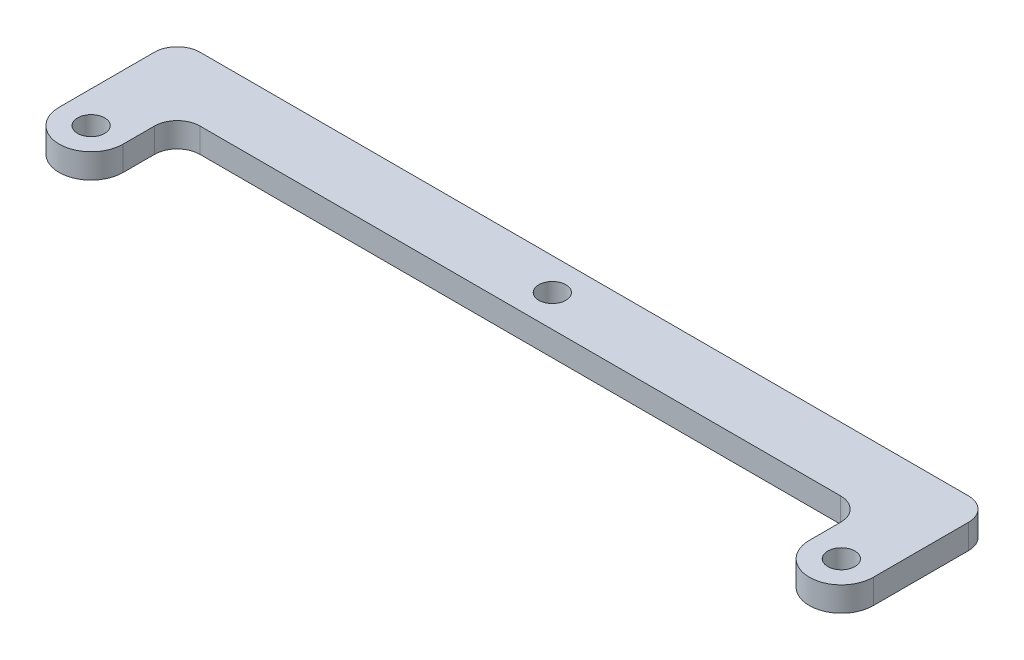
ISO-10303-21;
HEADER;
FILE_DESCRIPTION(('STEP AP214'),'2;1');
FILE_NAME('part.step','',(''),(''),'','','');
FILE_SCHEMA(('AUTOMOTIVE_DESIGN { 1 0 10303 214 1 1 1 1 }'));
ENDSEC;
DATA;
#1=APPLICATION_CONTEXT('core data for automotive mechanical design processes');
#2=APPLICATION_PROTOCOL_DEFINITION('international standard','automotive_design',2000,#1);
#3=PRODUCT_CONTEXT('',#1,'mechanical');
#4=PRODUCT('Part','Part','',(#3));
#5=PRODUCT_RELATED_PRODUCT_CATEGORY('part','',(#4));
#6=PRODUCT_DEFINITION_FORMATION('','',#4);
#7=PRODUCT_DEFINITION_CONTEXT('part definition',#1,'design');
#8=PRODUCT_DEFINITION('design','',#6,#7);
#9=PRODUCT_DEFINITION_SHAPE('','',#8);
#10=(LENGTH_UNIT() NAMED_UNIT(*) SI_UNIT(.MILLI.,.METRE.));
#11=(NAMED_UNIT(*) PLANE_ANGLE_UNIT() SI_UNIT($,.RADIAN.));
#12=(NAMED_UNIT(*) SI_UNIT($,.STERADIAN.) SOLID_ANGLE_UNIT());
#13=UNCERTAINTY_MEASURE_WITH_UNIT(LENGTH_MEASURE(1.E-05),#10,'distance_accuracy_value','');
#14=(GEOMETRIC_REPRESENTATION_CONTEXT(3) GLOBAL_UNCERTAINTY_ASSIGNED_CONTEXT((#13)) GLOBAL_UNIT_ASSIGNED_CONTEXT((#10,
#11,#12)) REPRESENTATION_CONTEXT('',''));
#15=CARTESIAN_POINT('',(0.,0.,0.));
#16=DIRECTION('',(0.,0.,1.));
#17=DIRECTION('',(1.,0.,0.));
#18=AXIS2_PLACEMENT_3D('',#15,#16,#17);
#19=CARTESIAN_POINT('',(-31.25,2.,-0.749999999999998));
#20=DIRECTION('',(0.,-1.,0.));
#21=DIRECTION('',(0.,0.,-1.));
#22=AXIS2_PLACEMENT_3D('',#19,#20,#21);
#23=CYLINDRICAL_SURFACE('',#22,1.85);
#24=CARTESIAN_POINT('',(-31.25,0.,-0.749999999999998));
#25=DIRECTION('',(0.,1.,0.));
#26=DIRECTION('',(0.,0.,1.));
#27=AXIS2_PLACEMENT_3D('',#24,#25,#26);
#28=CIRCLE('',#27,1.85);
#29=CARTESIAN_POINT('',(-33.1,0.,-0.749999999999985));
#30=VERTEX_POINT('',#29);
#31=CARTESIAN_POINT('',(-31.25,0.,-2.6));
#32=VERTEX_POINT('',#31);
#33=EDGE_CURVE('E168',#30,#32,#28,.F.);
#34=ORIENTED_EDGE('',*,*,#33,.F.);
#35=DIRECTION('',(0.,-1.,0.));
#36=VECTOR('',#35,1.);
#37=CARTESIAN_POINT('',(-33.1,2.,-0.749999999999985));
#38=LINE('',#37,#36);
#39=CARTESIAN_POINT('',(-33.1,2.,-0.749999999999985));
#40=VERTEX_POINT('',#39);
#41=EDGE_CURVE('E11',#40,#30,#38,.T.);
#42=ORIENTED_EDGE('',*,*,#41,.F.);
#43=CARTESIAN_POINT('',(-31.25,2.,-0.749999999999998));
#44=DIRECTION('',(0.,1.,0.));
#45=DIRECTION('',(0.,0.,1.));
#46=AXIS2_PLACEMENT_3D('',#43,#44,#45);
#47=CIRCLE('',#46,1.85);
#48=CARTESIAN_POINT('',(-31.25,2.,-2.6));
#49=VERTEX_POINT('',#48);
#50=EDGE_CURVE('E206',#40,#49,#47,.F.);
#51=ORIENTED_EDGE('',*,*,#50,.T.);
#52=DIRECTION('',(0.,-1.,0.));
#53=VECTOR('',#52,1.);
#54=CARTESIAN_POINT('',(-31.25,2.,-2.6));
#55=LINE('',#54,#53);
#56=EDGE_CURVE('E57',#49,#32,#55,.T.);
#57=ORIENTED_EDGE('',*,*,#56,.T.);
#58=EDGE_LOOP('',(#34,#42,#51,#57));
#59=FACE_BOUND('',#58,.T.);
#60=ADVANCED_FACE('F41',(#59),#23,.T.);
#61=CARTESIAN_POINT('',(-33.1,2.,0.));
#62=DIRECTION('',(-1.,0.,0.));
#63=DIRECTION('',(0.,0.,1.));
#64=AXIS2_PLACEMENT_3D('',#61,#62,#63);
#65=PLANE('',#64);
#66=DIRECTION('',(0.,0.,-1.));
#67=VECTOR('',#66,1.);
#68=CARTESIAN_POINT('',(-33.1,0.,0.));
#69=LINE('',#68,#67);
#70=CARTESIAN_POINT('',(-33.1,0.,7.));
#71=VERTEX_POINT('',#70);
#72=EDGE_CURVE('E170',#71,#30,#69,.T.);
#73=ORIENTED_EDGE('',*,*,#72,.F.);
#74=DIRECTION('',(0.,-1.,0.));
#75=VECTOR('',#74,1.);
#76=CARTESIAN_POINT('',(-33.1,2.,7.));
#77=LINE('',#76,#75);
#78=CARTESIAN_POINT('',(-33.1,2.,7.));
#79=VERTEX_POINT('',#78);
#80=EDGE_CURVE('E49',#79,#71,#77,.T.);
#81=ORIENTED_EDGE('',*,*,#80,.F.);
#82=DIRECTION('',(0.,0.,-1.));
#83=VECTOR('',#82,1.);
#84=CARTESIAN_POINT('',(-33.1,2.,0.));
#85=LINE('',#84,#83);
#86=EDGE_CURVE('E240',#79,#40,#85,.T.);
#87=ORIENTED_EDGE('',*,*,#86,.T.);
#88=ORIENTED_EDGE('',*,*,#41,.T.);
#89=EDGE_LOOP('',(#73,#81,#87,#88));
#90=FACE_BOUND('',#89,.T.);
#91=ADVANCED_FACE('F239',(#90),#65,.T.);
#92=CARTESIAN_POINT('',(-30.5,2.,7.));
#93=DIRECTION('',(0.,-1.,0.));
#94=DIRECTION('',(0.,0.,-1.));
#95=AXIS2_PLACEMENT_3D('',#92,#93,#94);
#96=CYLINDRICAL_SURFACE('',#95,2.6);
#97=CARTESIAN_POINT('',(-30.5,0.,7.));
#98=DIRECTION('',(0.,1.,0.));
#99=DIRECTION('',(0.,0.,1.));
#100=AXIS2_PLACEMENT_3D('',#97,#98,#99);
#101=CIRCLE('',#100,2.6);
#102=CARTESIAN_POINT('',(-27.9,0.,7.));
#103=VERTEX_POINT('',#102);
#104=EDGE_CURVE('E173',#71,#103,#101,.T.);
#105=ORIENTED_EDGE('',*,*,#104,.T.);
#106=DIRECTION('',(0.,-1.,0.));
#107=VECTOR('',#106,1.);
#108=CARTESIAN_POINT('',(-27.9,2.,7.));
#109=LINE('',#108,#107);
#110=CARTESIAN_POINT('',(-27.9,2.,7.));
#111=VERTEX_POINT('',#110);
#112=EDGE_CURVE('E222',#111,#103,#109,.T.);
#113=ORIENTED_EDGE('',*,*,#112,.F.);
#114=CARTESIAN_POINT('',(-30.5,2.,7.));
#115=DIRECTION('',(0.,1.,0.));
#116=DIRECTION('',(0.,0.,1.));
#117=AXIS2_PLACEMENT_3D('',#114,#115,#116);
#118=CIRCLE('',#117,2.6);
#119=EDGE_CURVE('E229',#79,#111,#118,.T.);
#120=ORIENTED_EDGE('',*,*,#119,.F.);
#121=ORIENTED_EDGE('',*,*,#80,.T.);
#122=EDGE_LOOP('',(#105,#113,#120,#121));
#123=FACE_BOUND('',#122,.T.);
#124=ADVANCED_FACE('F227',(#123),#96,.T.);
#125=CARTESIAN_POINT('',(-27.9,2.,0.));
#126=DIRECTION('',(-1.,0.,0.));
#127=DIRECTION('',(0.,0.,1.));
#128=AXIS2_PLACEMENT_3D('',#125,#126,#127);
#129=PLANE('',#128);
#130=DIRECTION('',(0.,0.,-1.));
#131=VECTOR('',#130,1.);
#132=CARTESIAN_POINT('',(-27.9,0.,0.));
#133=LINE('',#132,#131);
#134=CARTESIAN_POINT('',(-27.9,0.,4.45000000000001));
#135=VERTEX_POINT('',#134);
#136=EDGE_CURVE('E175',#103,#135,#133,.T.);
#137=ORIENTED_EDGE('',*,*,#136,.T.);
#138=DIRECTION('',(0.,-1.,0.));
#139=VECTOR('',#138,1.);
#140=CARTESIAN_POINT('',(-27.9,2.,4.45000000000001));
#141=LINE('',#140,#139);
#142=CARTESIAN_POINT('',(-27.9,2.,4.45000000000001));
#143=VERTEX_POINT('',#142);
#144=EDGE_CURVE('E219',#143,#135,#141,.T.);
#145=ORIENTED_EDGE('',*,*,#144,.F.);
#146=DIRECTION('',(0.,0.,-1.));
#147=VECTOR('',#146,1.);
#148=CARTESIAN_POINT('',(-27.9,2.,0.));
#149=LINE('',#148,#147);
#150=EDGE_CURVE('E444',#111,#143,#149,.T.);
#151=ORIENTED_EDGE('',*,*,#150,.F.);
#152=ORIENTED_EDGE('',*,*,#112,.T.);
#153=EDGE_LOOP('',(#137,#145,#151,#152));
#154=FACE_BOUND('',#153,.T.);
#155=ADVANCED_FACE('F263',(#154),#129,.F.);
#156=CARTESIAN_POINT('',(-26.05,2.,4.45));
#157=DIRECTION('',(0.,-1.,0.));
#158=DIRECTION('',(0.,0.,-1.));
#159=AXIS2_PLACEMENT_3D('',#156,#157,#158);
#160=CYLINDRICAL_SURFACE('',#159,1.85);
#161=CARTESIAN_POINT('',(-26.05,0.,4.45));
#162=DIRECTION('',(0.,1.,0.));
#163=DIRECTION('',(0.,0.,1.));
#164=AXIS2_PLACEMENT_3D('',#161,#162,#163);
#165=CIRCLE('',#164,1.85);
#166=CARTESIAN_POINT('',(-26.05,0.,2.6));
#167=VERTEX_POINT('',#166);
#168=EDGE_CURVE('E177',#135,#167,#165,.F.);
#169=ORIENTED_EDGE('',*,*,#168,.T.);
#170=DIRECTION('',(0.,-1.,0.));
#171=VECTOR('',#170,1.);
#172=CARTESIAN_POINT('',(-26.05,2.,2.6));
#173=LINE('',#172,#171);
#174=CARTESIAN_POINT('',(-26.05,2.,2.6));
#175=VERTEX_POINT('',#174);
#176=EDGE_CURVE('E216',#175,#167,#173,.T.);
#177=ORIENTED_EDGE('',*,*,#176,.F.);
#178=CARTESIAN_POINT('',(-26.05,2.,4.45));
#179=DIRECTION('',(0.,1.,0.));
#180=DIRECTION('',(0.,0.,1.));
#181=AXIS2_PLACEMENT_3D('',#178,#179,#180);
#182=CIRCLE('',#181,1.85);
#183=EDGE_CURVE('E442',#143,#175,#182,.F.);
#184=ORIENTED_EDGE('',*,*,#183,.F.);
#185=ORIENTED_EDGE('',*,*,#144,.T.);
#186=EDGE_LOOP('',(#169,#177,#184,#185));
#187=FACE_BOUND('',#186,.T.);
#188=ADVANCED_FACE('F268',(#187),#160,.F.);
#189=CARTESIAN_POINT('',(0.,2.,2.6));
#190=DIRECTION('',(0.,0.,-1.));
#191=DIRECTION('',(-1.,0.,0.));
#192=AXIS2_PLACEMENT_3D('',#189,#190,#191);
#193=PLANE('',#192);
#194=DIRECTION('',(1.,0.,0.));
#195=VECTOR('',#194,1.);
#196=CARTESIAN_POINT('',(0.,0.,2.6));
#197=LINE('',#196,#195);
#198=CARTESIAN_POINT('',(26.05,0.,2.6));
#199=VERTEX_POINT('',#198);
#200=EDGE_CURVE('E179',#167,#199,#197,.T.);
#201=ORIENTED_EDGE('',*,*,#200,.T.);
#202=DIRECTION('',(0.,-1.,0.));
#203=VECTOR('',#202,1.);
#204=CARTESIAN_POINT('',(26.05,2.,2.6));
#205=LINE('',#204,#203);
#206=CARTESIAN_POINT('',(26.05,2.,2.6));
#207=VERTEX_POINT('',#206);
#208=EDGE_CURVE('E214',#207,#199,#205,.T.);
#209=ORIENTED_EDGE('',*,*,#208,.F.);
#210=DIRECTION('',(1.,0.,0.));
#211=VECTOR('',#210,1.);
#212=CARTESIAN_POINT('',(0.,2.,2.6));
#213=LINE('',#212,#211);
#214=EDGE_CURVE('E446',#175,#207,#213,.T.);
#215=ORIENTED_EDGE('',*,*,#214,.F.);
#216=ORIENTED_EDGE('',*,*,#176,.T.);
#217=EDGE_LOOP('',(#201,#209,#215,#216));
#218=FACE_BOUND('',#217,.T.);
#219=ADVANCED_FACE('F272',(#218),#193,.F.);
#220=CARTESIAN_POINT('',(26.05,2.,4.45));
#221=DIRECTION('',(0.,-1.,0.));
#222=DIRECTION('',(0.,0.,-1.));
#223=AXIS2_PLACEMENT_3D('',#220,#221,#222);
#224=CYLINDRICAL_SURFACE('',#223,1.85);
#225=CARTESIAN_POINT('',(26.05,0.,4.45));
#226=DIRECTION('',(0.,1.,0.));
#227=DIRECTION('',(0.,0.,1.));
#228=AXIS2_PLACEMENT_3D('',#225,#226,#227);
#229=CIRCLE('',#228,1.85);
#230=CARTESIAN_POINT('',(27.9,0.,4.45000000000001));
#231=VERTEX_POINT('',#230);
#232=EDGE_CURVE('E182',#231,#199,#229,.T.);
#233=ORIENTED_EDGE('',*,*,#232,.F.);
#234=DIRECTION('',(0.,-1.,0.));
#235=VECTOR('',#234,1.);
#236=CARTESIAN_POINT('',(27.9,2.,4.45000000000001));
#237=LINE('',#236,#235);
#238=CARTESIAN_POINT('',(27.9,2.,4.45000000000001));
#239=VERTEX_POINT('',#238);
#240=EDGE_CURVE('E212',#239,#231,#237,.T.);
#241=ORIENTED_EDGE('',*,*,#240,.F.);
#242=CARTESIAN_POINT('',(26.05,2.,4.45));
#243=DIRECTION('',(0.,1.,0.));
#244=DIRECTION('',(0.,0.,1.));
#245=AXIS2_PLACEMENT_3D('',#242,#243,#244);
#246=CIRCLE('',#245,1.85);
#247=EDGE_CURVE('E437',#239,#207,#246,.T.);
#248=ORIENTED_EDGE('',*,*,#247,.T.);
#249=ORIENTED_EDGE('',*,*,#208,.T.);
#250=EDGE_LOOP('',(#233,#241,#248,#249));
#251=FACE_BOUND('',#250,.T.);
#252=ADVANCED_FACE('F276',(#251),#224,.F.);
#253=CARTESIAN_POINT('',(27.9,2.,0.));
#254=DIRECTION('',(-1.,0.,0.));
#255=DIRECTION('',(0.,0.,1.));
#256=AXIS2_PLACEMENT_3D('',#253,#254,#255);
#257=PLANE('',#256);
#258=DIRECTION('',(0.,0.,-1.));
#259=VECTOR('',#258,1.);
#260=CARTESIAN_POINT('',(27.9,0.,0.));
#261=LINE('',#260,#259);
#262=CARTESIAN_POINT('',(27.9,0.,7.));
#263=VERTEX_POINT('',#262);
#264=EDGE_CURVE('E185',#263,#231,#261,.T.);
#265=ORIENTED_EDGE('',*,*,#264,.F.);
#266=DIRECTION('',(0.,-1.,0.));
#267=VECTOR('',#266,1.);
#268=CARTESIAN_POINT('',(27.9,2.,7.));
#269=LINE('',#268,#267);
#270=CARTESIAN_POINT('',(27.9,2.,7.));
#271=VERTEX_POINT('',#270);
#272=EDGE_CURVE('E210',#271,#263,#269,.T.);
#273=ORIENTED_EDGE('',*,*,#272,.F.);
#274=DIRECTION('',(0.,0.,-1.));
#275=VECTOR('',#274,1.);
#276=CARTESIAN_POINT('',(27.9,2.,0.));
#277=LINE('',#276,#275);
#278=EDGE_CURVE('E433',#271,#239,#277,.T.);
#279=ORIENTED_EDGE('',*,*,#278,.T.);
#280=ORIENTED_EDGE('',*,*,#240,.T.);
#281=EDGE_LOOP('',(#265,#273,#279,#280));
#282=FACE_BOUND('',#281,.T.);
#283=ADVANCED_FACE('F280',(#282),#257,.T.);
#284=CARTESIAN_POINT('',(30.5,2.,7.));
#285=DIRECTION('',(0.,-1.,0.));
#286=DIRECTION('',(0.,0.,-1.));
#287=AXIS2_PLACEMENT_3D('',#284,#285,#286);
#288=CYLINDRICAL_SURFACE('',#287,2.6);
#289=CARTESIAN_POINT('',(30.5,0.,7.));
#290=DIRECTION('',(0.,1.,0.));
#291=DIRECTION('',(0.,0.,1.));
#292=AXIS2_PLACEMENT_3D('',#289,#290,#291);
#293=CIRCLE('',#292,2.6);
#294=CARTESIAN_POINT('',(33.1,0.,7.));
#295=VERTEX_POINT('',#294);
#296=EDGE_CURVE('E188',#295,#263,#293,.F.);
#297=ORIENTED_EDGE('',*,*,#296,.F.);
#298=DIRECTION('',(0.,-1.,0.));
#299=VECTOR('',#298,1.);
#300=CARTESIAN_POINT('',(33.1,2.,7.));
#301=LINE('',#300,#299);
#302=CARTESIAN_POINT('',(33.1,2.,7.));
#303=VERTEX_POINT('',#302);
#304=EDGE_CURVE('E151',#303,#295,#301,.T.);
#305=ORIENTED_EDGE('',*,*,#304,.F.);
#306=CARTESIAN_POINT('',(30.5,2.,7.));
#307=DIRECTION('',(0.,1.,0.));
#308=DIRECTION('',(0.,0.,1.));
#309=AXIS2_PLACEMENT_3D('',#306,#307,#308);
#310=CIRCLE('',#309,2.6);
#311=EDGE_CURVE('E141',#303,#271,#310,.F.);
#312=ORIENTED_EDGE('',*,*,#311,.T.);
#313=ORIENTED_EDGE('',*,*,#272,.T.);
#314=EDGE_LOOP('',(#297,#305,#312,#313));
#315=FACE_BOUND('',#314,.T.);
#316=ADVANCED_FACE('F284',(#315),#288,.T.);
#317=CARTESIAN_POINT('',(33.1,2.,0.));
#318=DIRECTION('',(-1.,0.,0.));
#319=DIRECTION('',(0.,0.,1.));
#320=AXIS2_PLACEMENT_3D('',#317,#318,#319);
#321=PLANE('',#320);
#322=DIRECTION('',(0.,0.,-1.));
#323=VECTOR('',#322,1.);
#324=CARTESIAN_POINT('',(33.1,0.,0.));
#325=LINE('',#324,#323);
#326=CARTESIAN_POINT('',(33.1,0.,-0.749999999999985));
#327=VERTEX_POINT('',#326);
#328=EDGE_CURVE('E148',#295,#327,#325,.T.);
#329=ORIENTED_EDGE('',*,*,#328,.T.);
#330=DIRECTION('',(0.,-1.,0.));
#331=VECTOR('',#330,1.);
#332=CARTESIAN_POINT('',(33.1,2.,-0.749999999999985));
#333=LINE('',#332,#331);
#334=CARTESIAN_POINT('',(33.1,2.,-0.749999999999985));
#335=VERTEX_POINT('',#334);
#336=EDGE_CURVE('E145',#335,#327,#333,.T.);
#337=ORIENTED_EDGE('',*,*,#336,.F.);
#338=DIRECTION('',(0.,0.,-1.));
#339=VECTOR('',#338,1.);
#340=CARTESIAN_POINT('',(33.1,2.,0.));
#341=LINE('',#340,#339);
#342=EDGE_CURVE('E132',#303,#335,#341,.T.);
#343=ORIENTED_EDGE('',*,*,#342,.F.);
#344=ORIENTED_EDGE('',*,*,#304,.T.);
#345=EDGE_LOOP('',(#329,#337,#343,#344));
#346=FACE_BOUND('',#345,.T.);
#347=ADVANCED_FACE('F146',(#346),#321,.F.);
#348=CARTESIAN_POINT('',(31.25,2.,-0.749999999999998));
#349=DIRECTION('',(0.,-1.,0.));
#350=DIRECTION('',(0.,0.,-1.));
#351=AXIS2_PLACEMENT_3D('',#348,#349,#350);
#352=CYLINDRICAL_SURFACE('',#351,1.85);
#353=CARTESIAN_POINT('',(31.25,0.,-0.749999999999998));
#354=DIRECTION('',(0.,1.,0.));
#355=DIRECTION('',(0.,0.,1.));
#356=AXIS2_PLACEMENT_3D('',#353,#354,#355);
#357=CIRCLE('',#356,1.85);
#358=CARTESIAN_POINT('',(31.25,0.,-2.6));
#359=VERTEX_POINT('',#358);
#360=EDGE_CURVE('E192',#327,#359,#357,.T.);
#361=ORIENTED_EDGE('',*,*,#360,.T.);
#362=DIRECTION('',(0.,-1.,0.));
#363=VECTOR('',#362,1.);
#364=CARTESIAN_POINT('',(31.25,2.,-2.6));
#365=LINE('',#364,#363);
#366=CARTESIAN_POINT('',(31.25,2.,-2.6));
#367=VERTEX_POINT('',#366);
#368=EDGE_CURVE('E95',#367,#359,#365,.T.);
#369=ORIENTED_EDGE('',*,*,#368,.F.);
#370=CARTESIAN_POINT('',(31.25,2.,-0.749999999999998));
#371=DIRECTION('',(0.,1.,0.));
#372=DIRECTION('',(0.,0.,1.));
#373=AXIS2_PLACEMENT_3D('',#370,#371,#372);
#374=CIRCLE('',#373,1.85);
#375=EDGE_CURVE('E138',#335,#367,#374,.T.);
#376=ORIENTED_EDGE('',*,*,#375,.F.);
#377=ORIENTED_EDGE('',*,*,#336,.T.);
#378=EDGE_LOOP('',(#361,#369,#376,#377));
#379=FACE_BOUND('',#378,.T.);
#380=ADVANCED_FACE('F153',(#379),#352,.T.);
#381=CARTESIAN_POINT('',(-30.5,2.,7.));
#382=DIRECTION('',(0.,-1.,0.));
#383=DIRECTION('',(0.,0.,-1.));
#384=AXIS2_PLACEMENT_3D('',#381,#382,#383);
#385=CYLINDRICAL_SURFACE('',#384,1.1);
#386=CARTESIAN_POINT('',(-30.5,2.,7.));
#387=DIRECTION('',(0.,1.,0.));
#388=DIRECTION('',(0.,0.,1.));
#389=AXIS2_PLACEMENT_3D('',#386,#387,#388);
#390=CIRCLE('',#389,1.1);
#391=CARTESIAN_POINT('',(-30.5,2.,8.1));
#392=VERTEX_POINT('',#391);
#393=EDGE_CURVE('E162',#392,#392,#390,.T.);
#394=ORIENTED_EDGE('',*,*,#393,.T.);
#395=EDGE_LOOP('',(#394));
#396=FACE_BOUND('',#395,.T.);
#397=CARTESIAN_POINT('',(-30.5,0.,7.));
#398=DIRECTION('',(0.,1.,0.));
#399=DIRECTION('',(0.,0.,1.));
#400=AXIS2_PLACEMENT_3D('',#397,#398,#399);
#401=CIRCLE('',#400,1.1);
#402=CARTESIAN_POINT('',(-30.5,0.,8.1));
#403=VERTEX_POINT('',#402);
#404=EDGE_CURVE('E200',#403,#403,#401,.T.);
#405=ORIENTED_EDGE('',*,*,#404,.F.);
#406=EDGE_LOOP('',(#405));
#407=FACE_BOUND('',#406,.T.);
#408=ADVANCED_FACE('F252',(#396,#407),#385,.F.);
#409=CARTESIAN_POINT('',(0.,2.,0.));
#410=DIRECTION('',(0.,-1.,0.));
#411=DIRECTION('',(0.,0.,-1.));
#412=AXIS2_PLACEMENT_3D('',#409,#410,#411);
#413=CYLINDRICAL_SURFACE('',#412,1.1);
#414=CARTESIAN_POINT('',(0.,2.,0.));
#415=DIRECTION('',(0.,1.,0.));
#416=DIRECTION('',(0.,0.,1.));
#417=AXIS2_PLACEMENT_3D('',#414,#415,#416);
#418=CIRCLE('',#417,1.1);
#419=CARTESIAN_POINT('',(0.,2.,1.1));
#420=VERTEX_POINT('',#419);
#421=EDGE_CURVE('E156',#420,#420,#418,.T.);
#422=ORIENTED_EDGE('',*,*,#421,.T.);
#423=EDGE_LOOP('',(#422));
#424=FACE_BOUND('',#423,.T.);
#425=CARTESIAN_POINT('',(0.,0.,0.));
#426=DIRECTION('',(0.,1.,0.));
#427=DIRECTION('',(0.,0.,1.));
#428=AXIS2_PLACEMENT_3D('',#425,#426,#427);
#429=CIRCLE('',#428,1.1);
#430=CARTESIAN_POINT('',(0.,0.,1.1));
#431=VERTEX_POINT('',#430);
#432=EDGE_CURVE('E197',#431,#431,#429,.T.);
#433=ORIENTED_EDGE('',*,*,#432,.F.);
#434=EDGE_LOOP('',(#433));
#435=FACE_BOUND('',#434,.T.);
#436=ADVANCED_FACE('F244',(#424,#435),#413,.F.);
#437=CARTESIAN_POINT('',(0.,2.,-2.6));
#438=DIRECTION('',(0.,0.,-1.));
#439=DIRECTION('',(-1.,0.,0.));
#440=AXIS2_PLACEMENT_3D('',#437,#438,#439);
#441=PLANE('',#440);
#442=DIRECTION('',(1.,0.,0.));
#443=VECTOR('',#442,1.);
#444=CARTESIAN_POINT('',(0.,0.,-2.6));
#445=LINE('',#444,#443);
#446=EDGE_CURVE('E194',#32,#359,#445,.T.);
#447=ORIENTED_EDGE('',*,*,#446,.F.);
#448=ORIENTED_EDGE('',*,*,#56,.F.);
#449=DIRECTION('',(1.,0.,0.));
#450=VECTOR('',#449,1.);
#451=CARTESIAN_POINT('',(0.,2.,-2.6));
#452=LINE('',#451,#450);
#453=EDGE_CURVE('E154',#49,#367,#452,.T.);
#454=ORIENTED_EDGE('',*,*,#453,.T.);
#455=ORIENTED_EDGE('',*,*,#368,.T.);
#456=EDGE_LOOP('',(#447,#448,#454,#455));
#457=FACE_BOUND('',#456,.T.);
#458=ADVANCED_FACE('F241',(#457),#441,.T.);
#459=CARTESIAN_POINT('',(30.5,2.,7.));
#460=DIRECTION('',(0.,-1.,0.));
#461=DIRECTION('',(0.,0.,-1.));
#462=AXIS2_PLACEMENT_3D('',#459,#460,#461);
#463=CYLINDRICAL_SURFACE('',#462,1.1);
#464=CARTESIAN_POINT('',(30.5,2.,7.));
#465=DIRECTION('',(0.,1.,0.));
#466=DIRECTION('',(0.,0.,1.));
#467=AXIS2_PLACEMENT_3D('',#464,#465,#466);
#468=CIRCLE('',#467,1.1);
#469=CARTESIAN_POINT('',(30.5,2.,8.1));
#470=VERTEX_POINT('',#469);
#471=EDGE_CURVE('E165',#470,#470,#468,.F.);
#472=ORIENTED_EDGE('',*,*,#471,.F.);
#473=EDGE_LOOP('',(#472));
#474=FACE_BOUND('',#473,.T.);
#475=CARTESIAN_POINT('',(30.5,0.,7.));
#476=DIRECTION('',(0.,1.,0.));
#477=DIRECTION('',(0.,0.,1.));
#478=AXIS2_PLACEMENT_3D('',#475,#476,#477);
#479=CIRCLE('',#478,1.1);
#480=CARTESIAN_POINT('',(30.5,0.,8.1));
#481=VERTEX_POINT('',#480);
#482=EDGE_CURVE('E203',#481,#481,#479,.F.);
#483=ORIENTED_EDGE('',*,*,#482,.T.);
#484=EDGE_LOOP('',(#483));
#485=FACE_BOUND('',#484,.T.);
#486=ADVANCED_FACE('F243',(#474,#485),#463,.F.);
#487=CARTESIAN_POINT('',(0.,2.,0.));
#488=DIRECTION('',(0.,1.,0.));
#489=DIRECTION('',(0.,0.,1.));
#490=AXIS2_PLACEMENT_3D('',#487,#488,#489);
#491=PLANE('',#490);
#492=ORIENTED_EDGE('',*,*,#50,.F.);
#493=ORIENTED_EDGE('',*,*,#86,.F.);
#494=ORIENTED_EDGE('',*,*,#119,.T.);
#495=ORIENTED_EDGE('',*,*,#150,.T.);
#496=ORIENTED_EDGE('',*,*,#183,.T.);
#497=ORIENTED_EDGE('',*,*,#214,.T.);
#498=ORIENTED_EDGE('',*,*,#247,.F.);
#499=ORIENTED_EDGE('',*,*,#278,.F.);
#500=ORIENTED_EDGE('',*,*,#311,.F.);
#501=ORIENTED_EDGE('',*,*,#342,.T.);
#502=ORIENTED_EDGE('',*,*,#375,.T.);
#503=ORIENTED_EDGE('',*,*,#453,.F.);
#504=EDGE_LOOP('',(#492,#493,#494,#495,#496,#497,#498,#499,#500,#501,#502,#503));
#505=FACE_BOUND('',#504,.T.);
#506=ORIENTED_EDGE('',*,*,#421,.F.);
#507=EDGE_LOOP('',(#506));
#508=FACE_BOUND('',#507,.T.);
#509=ORIENTED_EDGE('',*,*,#393,.F.);
#510=EDGE_LOOP('',(#509));
#511=FACE_BOUND('',#510,.T.);
#512=ORIENTED_EDGE('',*,*,#471,.T.);
#513=EDGE_LOOP('',(#512));
#514=FACE_BOUND('',#513,.T.);
#515=ADVANCED_FACE('F134',(#505,#508,#511,#514),#491,.T.);
#516=CARTESIAN_POINT('',(0.,0.,0.));
#517=DIRECTION('',(0.,1.,0.));
#518=DIRECTION('',(0.,0.,1.));
#519=AXIS2_PLACEMENT_3D('',#516,#517,#518);
#520=PLANE('',#519);
#521=ORIENTED_EDGE('',*,*,#33,.T.);
#522=ORIENTED_EDGE('',*,*,#446,.T.);
#523=ORIENTED_EDGE('',*,*,#360,.F.);
#524=ORIENTED_EDGE('',*,*,#328,.F.);
#525=ORIENTED_EDGE('',*,*,#296,.T.);
#526=ORIENTED_EDGE('',*,*,#264,.T.);
#527=ORIENTED_EDGE('',*,*,#232,.T.);
#528=ORIENTED_EDGE('',*,*,#200,.F.);
#529=ORIENTED_EDGE('',*,*,#168,.F.);
#530=ORIENTED_EDGE('',*,*,#136,.F.);
#531=ORIENTED_EDGE('',*,*,#104,.F.);
#532=ORIENTED_EDGE('',*,*,#72,.T.);
#533=EDGE_LOOP('',(#521,#522,#523,#524,#525,#526,#527,#528,#529,#530,#531,#532));
#534=FACE_BOUND('',#533,.T.);
#535=ORIENTED_EDGE('',*,*,#432,.T.);
#536=EDGE_LOOP('',(#535));
#537=FACE_BOUND('',#536,.T.);
#538=ORIENTED_EDGE('',*,*,#404,.T.);
#539=EDGE_LOOP('',(#538));
#540=FACE_BOUND('',#539,.T.);
#541=ORIENTED_EDGE('',*,*,#482,.F.);
#542=EDGE_LOOP('',(#541));
#543=FACE_BOUND('',#542,.T.);
#544=ADVANCED_FACE('F236',(#534,#537,#540,#543),#520,.F.);
#545=CLOSED_SHELL('',(#60,#91,#124,#155,#188,#219,#252,#283,#316,#347,#380,#408,#436,#458,#486,
#515,#544));
#546=MANIFOLD_SOLID_BREP('B2',#545);
#547=ADVANCED_BREP_SHAPE_REPRESENTATION('',(#18,#546),#14);
#548=SHAPE_DEFINITION_REPRESENTATION(#9,#547);
ENDSEC;
END-ISO-10303-21;
